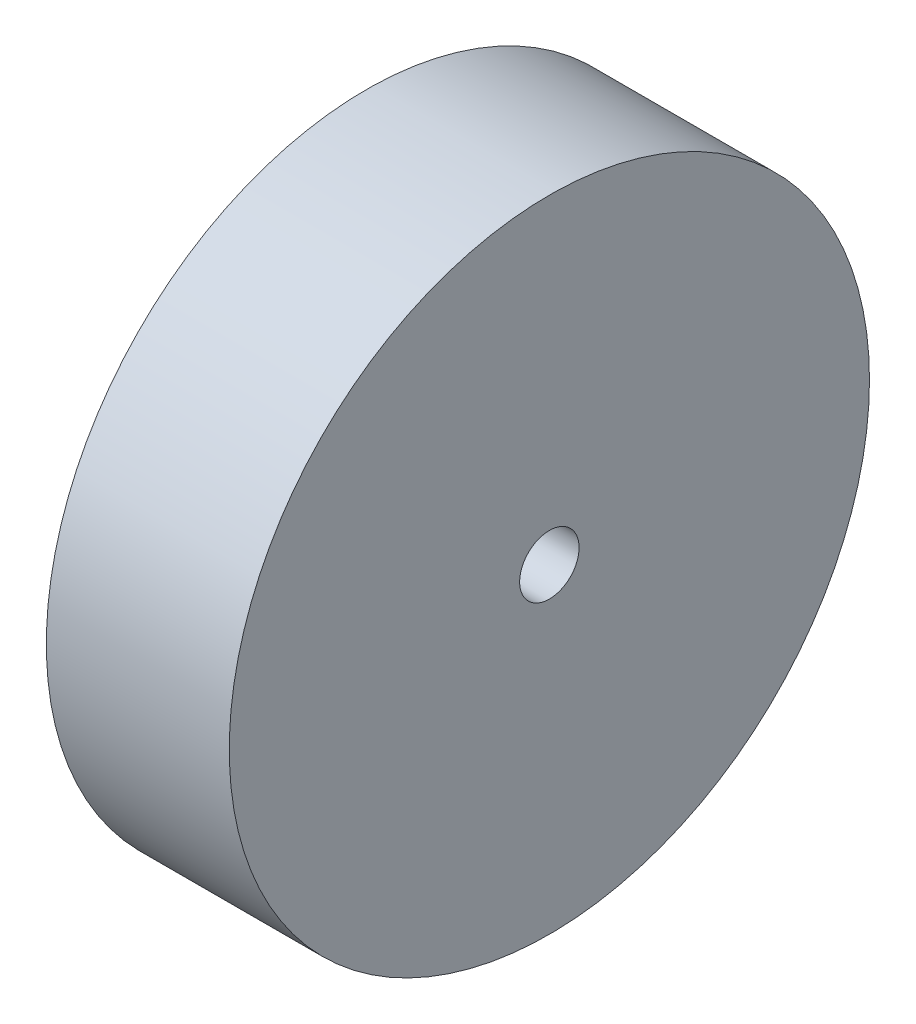
ISO-10303-21;
HEADER;
FILE_DESCRIPTION(('STEP AP214'),'2;1');
FILE_NAME('part.step','',(''),(''),'','','');
FILE_SCHEMA(('AUTOMOTIVE_DESIGN { 1 0 10303 214 1 1 1 1 }'));
ENDSEC;
DATA;
#1=APPLICATION_CONTEXT('core data for automotive mechanical design processes');
#2=APPLICATION_PROTOCOL_DEFINITION('international standard','automotive_design',2000,#1);
#3=PRODUCT_CONTEXT('',#1,'mechanical');
#4=PRODUCT('Part','Part','',(#3));
#5=PRODUCT_RELATED_PRODUCT_CATEGORY('part','',(#4));
#6=PRODUCT_DEFINITION_FORMATION('','',#4);
#7=PRODUCT_DEFINITION_CONTEXT('part definition',#1,'design');
#8=PRODUCT_DEFINITION('design','',#6,#7);
#9=PRODUCT_DEFINITION_SHAPE('','',#8);
#10=(LENGTH_UNIT() NAMED_UNIT(*) SI_UNIT(.MILLI.,.METRE.));
#11=(NAMED_UNIT(*) PLANE_ANGLE_UNIT() SI_UNIT($,.RADIAN.));
#12=(NAMED_UNIT(*) SI_UNIT($,.STERADIAN.) SOLID_ANGLE_UNIT());
#13=UNCERTAINTY_MEASURE_WITH_UNIT(LENGTH_MEASURE(1.E-05),#10,'distance_accuracy_value','');
#14=(GEOMETRIC_REPRESENTATION_CONTEXT(3) GLOBAL_UNCERTAINTY_ASSIGNED_CONTEXT((#13)) GLOBAL_UNIT_ASSIGNED_CONTEXT((#10,
#11,#12)) REPRESENTATION_CONTEXT('',''));
#15=CARTESIAN_POINT('',(0.,0.,0.));
#16=DIRECTION('',(0.,0.,1.));
#17=DIRECTION('',(1.,0.,0.));
#18=AXIS2_PLACEMENT_3D('',#15,#16,#17);
#19=CARTESIAN_POINT('',(96.6645059702907,49.9391207045371,20.0598973697158));
#20=DIRECTION('',(1.,0.,0.));
#21=DIRECTION('',(0.,0.,-1.));
#22=AXIS2_PLACEMENT_3D('',#19,#20,#21);
#23=CYLINDRICAL_SURFACE('',#22,35.);
#24=CARTESIAN_POINT('',(96.6645059702907,49.9391207045371,20.0598973697158));
#25=DIRECTION('',(1.,0.,0.));
#26=DIRECTION('',(0.,0.,-1.));
#27=AXIS2_PLACEMENT_3D('',#24,#25,#26);
#28=CIRCLE('',#27,35.);
#29=CARTESIAN_POINT('',(96.6645059702907,49.9391207045371,-14.9401026302842));
#30=VERTEX_POINT('',#29);
#31=EDGE_CURVE('E10',#30,#30,#28,.T.);
#32=ORIENTED_EDGE('',*,*,#31,.T.);
#33=EDGE_LOOP('',(#32));
#34=FACE_BOUND('',#33,.T.);
#35=CARTESIAN_POINT('',(116.664505970291,49.9391207045371,20.0598973697158));
#36=DIRECTION('',(1.,0.,0.));
#37=DIRECTION('',(0.,0.,-1.));
#38=AXIS2_PLACEMENT_3D('',#35,#36,#37);
#39=CIRCLE('',#38,35.);
#40=CARTESIAN_POINT('',(116.664505970291,49.9391207045371,-14.9401026302842));
#41=VERTEX_POINT('',#40);
#42=EDGE_CURVE('E41',#41,#41,#39,.T.);
#43=ORIENTED_EDGE('',*,*,#42,.F.);
#44=EDGE_LOOP('',(#43));
#45=FACE_BOUND('',#44,.T.);
#46=ADVANCED_FACE('F31',(#34,#45),#23,.T.);
#47=CARTESIAN_POINT('',(96.6645059702907,49.9391207045371,20.0598973697158));
#48=DIRECTION('',(1.,0.,0.));
#49=DIRECTION('',(0.,0.,-1.));
#50=AXIS2_PLACEMENT_3D('',#47,#48,#49);
#51=PLANE('',#50);
#52=CARTESIAN_POINT('',(96.6645059702907,49.9391207045371,20.0598973697158));
#53=DIRECTION('',(1.,0.,0.));
#54=DIRECTION('',(0.,0.,-1.));
#55=AXIS2_PLACEMENT_3D('',#52,#53,#54);
#56=CIRCLE('',#55,3.25);
#57=CARTESIAN_POINT('',(96.6645059702907,49.9391207045371,16.8098973697158));
#58=VERTEX_POINT('',#57);
#59=EDGE_CURVE('E37',#58,#58,#56,.T.);
#60=ORIENTED_EDGE('',*,*,#59,.T.);
#61=EDGE_LOOP('',(#60));
#62=FACE_BOUND('',#61,.T.);
#63=ORIENTED_EDGE('',*,*,#31,.F.);
#64=EDGE_LOOP('',(#63));
#65=FACE_BOUND('',#64,.T.);
#66=ADVANCED_FACE('F60',(#62,#65),#51,.F.);
#67=CARTESIAN_POINT('',(96.6645059702907,49.9391207045371,20.0598973697158));
#68=DIRECTION('',(1.,0.,0.));
#69=DIRECTION('',(0.,0.,-1.));
#70=AXIS2_PLACEMENT_3D('',#67,#68,#69);
#71=CYLINDRICAL_SURFACE('',#70,3.25);
#72=ORIENTED_EDGE('',*,*,#59,.F.);
#73=EDGE_LOOP('',(#72));
#74=FACE_BOUND('',#73,.T.);
#75=CARTESIAN_POINT('',(116.664505970291,49.9391207045371,20.0598973697158));
#76=DIRECTION('',(1.,0.,0.));
#77=DIRECTION('',(0.,0.,-1.));
#78=AXIS2_PLACEMENT_3D('',#75,#76,#77);
#79=CIRCLE('',#78,3.25);
#80=CARTESIAN_POINT('',(116.664505970291,49.9391207045371,16.8098973697158));
#81=VERTEX_POINT('',#80);
#82=EDGE_CURVE('E45',#81,#81,#79,.T.);
#83=ORIENTED_EDGE('',*,*,#82,.T.);
#84=EDGE_LOOP('',(#83));
#85=FACE_BOUND('',#84,.T.);
#86=ADVANCED_FACE('F51',(#74,#85),#71,.F.);
#87=CARTESIAN_POINT('',(116.664505970291,49.9391207045371,20.0598973697158));
#88=DIRECTION('',(1.,0.,0.));
#89=DIRECTION('',(0.,0.,-1.));
#90=AXIS2_PLACEMENT_3D('',#87,#88,#89);
#91=PLANE('',#90);
#92=ORIENTED_EDGE('',*,*,#42,.T.);
#93=EDGE_LOOP('',(#92));
#94=FACE_BOUND('',#93,.T.);
#95=ORIENTED_EDGE('',*,*,#82,.F.);
#96=EDGE_LOOP('',(#95));
#97=FACE_BOUND('',#96,.T.);
#98=ADVANCED_FACE('F53',(#94,#97),#91,.T.);
#99=CLOSED_SHELL('',(#46,#66,#86,#98));
#100=MANIFOLD_SOLID_BREP('B2',#99);
#101=ADVANCED_BREP_SHAPE_REPRESENTATION('',(#18,#100),#14);
#102=SHAPE_DEFINITION_REPRESENTATION(#9,#101);
ENDSEC;
END-ISO-10303-21;
